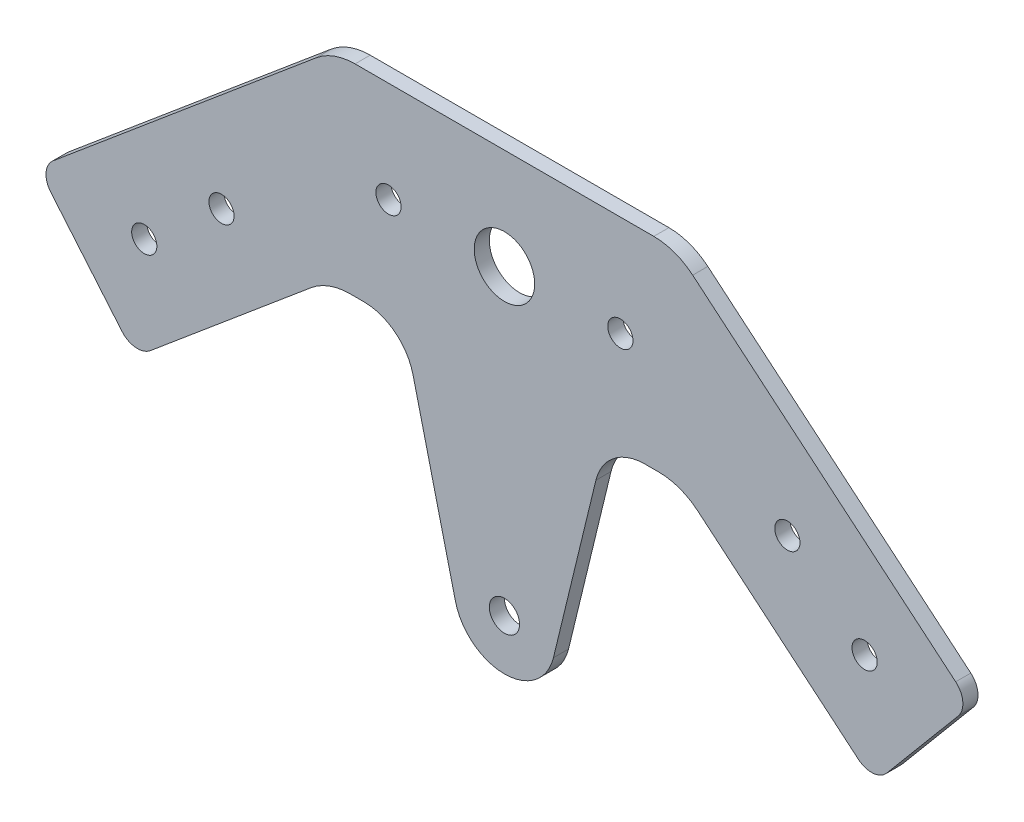
ISO-10303-21;
HEADER;
FILE_DESCRIPTION(('STEP AP214'),'2;1');
FILE_NAME('part.step','',(''),(''),'','','');
FILE_SCHEMA(('AUTOMOTIVE_DESIGN { 1 0 10303 214 1 1 1 1 }'));
ENDSEC;
DATA;
#1=APPLICATION_CONTEXT('core data for automotive mechanical design processes');
#2=APPLICATION_PROTOCOL_DEFINITION('international standard','automotive_design',2000,#1);
#3=PRODUCT_CONTEXT('',#1,'mechanical');
#4=PRODUCT('Part','Part','',(#3));
#5=PRODUCT_RELATED_PRODUCT_CATEGORY('part','',(#4));
#6=PRODUCT_DEFINITION_FORMATION('','',#4);
#7=PRODUCT_DEFINITION_CONTEXT('part definition',#1,'design');
#8=PRODUCT_DEFINITION('design','',#6,#7);
#9=PRODUCT_DEFINITION_SHAPE('','',#8);
#10=(LENGTH_UNIT() NAMED_UNIT(*) SI_UNIT(.MILLI.,.METRE.));
#11=(NAMED_UNIT(*) PLANE_ANGLE_UNIT() SI_UNIT($,.RADIAN.));
#12=(NAMED_UNIT(*) SI_UNIT($,.STERADIAN.) SOLID_ANGLE_UNIT());
#13=UNCERTAINTY_MEASURE_WITH_UNIT(LENGTH_MEASURE(1.E-05),#10,'distance_accuracy_value','');
#14=(GEOMETRIC_REPRESENTATION_CONTEXT(3) GLOBAL_UNCERTAINTY_ASSIGNED_CONTEXT((#13)) GLOBAL_UNIT_ASSIGNED_CONTEXT((#10,
#11,#12)) REPRESENTATION_CONTEXT('',''));
#15=CARTESIAN_POINT('',(0.,0.,0.));
#16=DIRECTION('',(0.,0.,1.));
#17=DIRECTION('',(1.,0.,0.));
#18=AXIS2_PLACEMENT_3D('',#15,#16,#17);
#19=CARTESIAN_POINT('',(32.3869359287038,-16.5346404567772,-3.));
#20=DIRECTION('',(0.,0.,1.));
#21=DIRECTION('',(1.,0.,0.));
#22=AXIS2_PLACEMENT_3D('',#19,#20,#21);
#23=CYLINDRICAL_SURFACE('',#22,10.);
#24=CARTESIAN_POINT('',(32.3869359287038,-16.5346404567772,0.));
#25=DIRECTION('',(0.,0.,-1.));
#26=DIRECTION('',(1.,0.,0.));
#27=AXIS2_PLACEMENT_3D('',#24,#25,#26);
#28=CIRCLE('',#27,10.);
#29=CARTESIAN_POINT('',(22.6691380416225,-14.1757415132365,0.));
#30=VERTEX_POINT('',#29);
#31=CARTESIAN_POINT('',(32.3869359287038,-6.53464045677716,0.));
#32=VERTEX_POINT('',#31);
#33=EDGE_CURVE('E216',#30,#32,#28,.T.);
#34=ORIENTED_EDGE('',*,*,#33,.F.);
#35=DIRECTION('',(0.,0.,1.));
#36=VECTOR('',#35,1.);
#37=CARTESIAN_POINT('',(22.6691380416225,-14.1757415132365,-3.));
#38=LINE('',#37,#36);
#39=CARTESIAN_POINT('',(22.6691380416225,-14.1757415132365,-3.));
#40=VERTEX_POINT('',#39);
#41=EDGE_CURVE('E11',#40,#30,#38,.T.);
#42=ORIENTED_EDGE('',*,*,#41,.F.);
#43=CARTESIAN_POINT('',(32.3869359287038,-16.5346404567772,-3.));
#44=DIRECTION('',(0.,0.,-1.));
#45=DIRECTION('',(1.,0.,0.));
#46=AXIS2_PLACEMENT_3D('',#43,#44,#45);
#47=CIRCLE('',#46,10.);
#48=CARTESIAN_POINT('',(32.3869359287038,-6.53464045677716,-3.));
#49=VERTEX_POINT('',#48);
#50=EDGE_CURVE('E279',#40,#49,#47,.T.);
#51=ORIENTED_EDGE('',*,*,#50,.T.);
#52=DIRECTION('',(0.,0.,1.));
#53=VECTOR('',#52,1.);
#54=CARTESIAN_POINT('',(32.3869359287038,-6.53464045677716,-3.));
#55=LINE('',#54,#53);
#56=EDGE_CURVE('E38',#49,#32,#55,.T.);
#57=ORIENTED_EDGE('',*,*,#56,.T.);
#58=EDGE_LOOP('',(#34,#42,#51,#57));
#59=FACE_BOUND('',#58,.T.);
#60=ADVANCED_FACE('F35',(#59),#23,.F.);
#61=CARTESIAN_POINT('',(22.6691380416225,-14.1757415132365,-3.));
#62=DIRECTION('',(0.971779788708134,-0.235889894354069,0.));
#63=DIRECTION('',(0.235889894354069,0.971779788708135,0.));
#64=AXIS2_PLACEMENT_3D('',#61,#62,#63);
#65=PLANE('',#64);
#66=DIRECTION('',(0.235889894354069,0.971779788708135,0.));
#67=VECTOR('',#66,1.);
#68=CARTESIAN_POINT('',(22.6691380416225,-14.1757415132365,0.));
#69=LINE('',#68,#67);
#70=CARTESIAN_POINT('',(14.2417373373162,-48.8935394003178,0.));
#71=VERTEX_POINT('',#70);
#72=EDGE_CURVE('E277',#71,#30,#69,.T.);
#73=ORIENTED_EDGE('',*,*,#72,.F.);
#74=DIRECTION('',(0.,0.,1.));
#75=VECTOR('',#74,1.);
#76=CARTESIAN_POINT('',(14.2417373373162,-48.8935394003178,-3.));
#77=LINE('',#76,#75);
#78=CARTESIAN_POINT('',(14.2417373373162,-48.8935394003178,-3.));
#79=VERTEX_POINT('',#78);
#80=EDGE_CURVE('E44',#79,#71,#77,.T.);
#81=ORIENTED_EDGE('',*,*,#80,.F.);
#82=DIRECTION('',(0.235889894354069,0.971779788708135,0.));
#83=VECTOR('',#82,1.);
#84=CARTESIAN_POINT('',(22.6691380416225,-14.1757415132365,-3.));
#85=LINE('',#84,#83);
#86=EDGE_CURVE('E206',#79,#40,#85,.T.);
#87=ORIENTED_EDGE('',*,*,#86,.T.);
#88=ORIENTED_EDGE('',*,*,#41,.T.);
#89=EDGE_LOOP('',(#73,#81,#87,#88));
#90=FACE_BOUND('',#89,.T.);
#91=ADVANCED_FACE('F320',(#90),#65,.T.);
#92=CARTESIAN_POINT('',(4.52393945023484,-46.5346404567771,-3.));
#93=DIRECTION('',(0.,0.,1.));
#94=DIRECTION('',(1.,0.,0.));
#95=AXIS2_PLACEMENT_3D('',#92,#93,#94);
#96=CYLINDRICAL_SURFACE('',#95,10.);
#97=CARTESIAN_POINT('',(4.52393945023484,-46.5346404567771,0.));
#98=DIRECTION('',(0.,0.,1.));
#99=DIRECTION('',(1.,0.,0.));
#100=AXIS2_PLACEMENT_3D('',#97,#98,#99);
#101=CIRCLE('',#100,10.);
#102=CARTESIAN_POINT('',(-5.19385843684652,-48.8935394003178,0.));
#103=VERTEX_POINT('',#102);
#104=EDGE_CURVE('E193',#103,#71,#101,.T.);
#105=ORIENTED_EDGE('',*,*,#104,.F.);
#106=DIRECTION('',(0.,0.,1.));
#107=VECTOR('',#106,1.);
#108=CARTESIAN_POINT('',(-5.19385843684652,-48.8935394003178,-3.));
#109=LINE('',#108,#107);
#110=CARTESIAN_POINT('',(-5.19385843684652,-48.8935394003178,-3.));
#111=VERTEX_POINT('',#110);
#112=EDGE_CURVE('E188',#111,#103,#109,.T.);
#113=ORIENTED_EDGE('',*,*,#112,.F.);
#114=CARTESIAN_POINT('',(4.52393945023484,-46.5346404567771,-3.));
#115=DIRECTION('',(0.,0.,1.));
#116=DIRECTION('',(1.,0.,0.));
#117=AXIS2_PLACEMENT_3D('',#114,#115,#116);
#118=CIRCLE('',#117,10.);
#119=EDGE_CURVE('E191',#111,#79,#118,.T.);
#120=ORIENTED_EDGE('',*,*,#119,.T.);
#121=ORIENTED_EDGE('',*,*,#80,.T.);
#122=EDGE_LOOP('',(#105,#113,#120,#121));
#123=FACE_BOUND('',#122,.T.);
#124=ADVANCED_FACE('F190',(#123),#96,.T.);
#125=CARTESIAN_POINT('',(-13.6212591411528,-14.1757415132365,-3.));
#126=DIRECTION('',(-0.971779788708135,-0.235889894354068,0.));
#127=DIRECTION('',(0.235889894354068,-0.971779788708135,0.));
#128=AXIS2_PLACEMENT_3D('',#125,#126,#127);
#129=PLANE('',#128);
#130=DIRECTION('',(0.235889894354068,-0.971779788708135,0.));
#131=VECTOR('',#130,1.);
#132=CARTESIAN_POINT('',(-13.6212591411528,-14.1757415132365,0.));
#133=LINE('',#132,#131);
#134=CARTESIAN_POINT('',(-13.6212591411528,-14.1757415132365,0.));
#135=VERTEX_POINT('',#134);
#136=EDGE_CURVE('E274',#135,#103,#133,.T.);
#137=ORIENTED_EDGE('',*,*,#136,.F.);
#138=DIRECTION('',(0.,0.,1.));
#139=VECTOR('',#138,1.);
#140=CARTESIAN_POINT('',(-13.6212591411528,-14.1757415132365,-3.));
#141=LINE('',#140,#139);
#142=CARTESIAN_POINT('',(-13.6212591411528,-14.1757415132365,-3.));
#143=VERTEX_POINT('',#142);
#144=EDGE_CURVE('E198',#143,#135,#141,.T.);
#145=ORIENTED_EDGE('',*,*,#144,.F.);
#146=DIRECTION('',(0.235889894354068,-0.971779788708135,0.));
#147=VECTOR('',#146,1.);
#148=CARTESIAN_POINT('',(-13.6212591411528,-14.1757415132365,-3.));
#149=LINE('',#148,#147);
#150=EDGE_CURVE('E204',#143,#111,#149,.T.);
#151=ORIENTED_EDGE('',*,*,#150,.T.);
#152=ORIENTED_EDGE('',*,*,#112,.T.);
#153=EDGE_LOOP('',(#137,#145,#151,#152));
#154=FACE_BOUND('',#153,.T.);
#155=ADVANCED_FACE('F208',(#154),#129,.T.);
#156=CARTESIAN_POINT('',(-23.3390570282341,-16.5346404567772,-3.));
#157=DIRECTION('',(0.,0.,1.));
#158=DIRECTION('',(1.,0.,0.));
#159=AXIS2_PLACEMENT_3D('',#156,#157,#158);
#160=CYLINDRICAL_SURFACE('',#159,10.);
#161=CARTESIAN_POINT('',(-23.3390570282341,-16.5346404567772,0.));
#162=DIRECTION('',(0.,0.,-1.));
#163=DIRECTION('',(1.,0.,0.));
#164=AXIS2_PLACEMENT_3D('',#161,#162,#163);
#165=CIRCLE('',#164,10.);
#166=CARTESIAN_POINT('',(-23.3390570282341,-6.53464045677716,0.));
#167=VERTEX_POINT('',#166);
#168=EDGE_CURVE('E271',#167,#135,#165,.T.);
#169=ORIENTED_EDGE('',*,*,#168,.F.);
#170=DIRECTION('',(0.,0.,1.));
#171=VECTOR('',#170,1.);
#172=CARTESIAN_POINT('',(-23.3390570282341,-6.53464045677716,-3.));
#173=LINE('',#172,#171);
#174=CARTESIAN_POINT('',(-23.3390570282341,-6.53464045677716,-3.));
#175=VERTEX_POINT('',#174);
#176=EDGE_CURVE('E283',#175,#167,#173,.T.);
#177=ORIENTED_EDGE('',*,*,#176,.F.);
#178=CARTESIAN_POINT('',(-23.3390570282341,-16.5346404567772,-3.));
#179=DIRECTION('',(0.,0.,-1.));
#180=DIRECTION('',(1.,0.,0.));
#181=AXIS2_PLACEMENT_3D('',#178,#179,#180);
#182=CIRCLE('',#181,10.);
#183=EDGE_CURVE('E209',#175,#143,#182,.T.);
#184=ORIENTED_EDGE('',*,*,#183,.T.);
#185=ORIENTED_EDGE('',*,*,#144,.T.);
#186=EDGE_LOOP('',(#169,#177,#184,#185));
#187=FACE_BOUND('',#186,.T.);
#188=ADVANCED_FACE('F333',(#187),#160,.F.);
#189=CARTESIAN_POINT('',(-26.1084177385707,-6.53464045677716,-3.));
#190=DIRECTION('',(0.,-1.,0.));
#191=DIRECTION('',(1.,0.,0.));
#192=AXIS2_PLACEMENT_3D('',#189,#190,#191);
#193=PLANE('',#192);
#194=DIRECTION('',(1.,0.,0.));
#195=VECTOR('',#194,1.);
#196=CARTESIAN_POINT('',(-26.1084177385707,-6.53464045677716,0.));
#197=LINE('',#196,#195);
#198=CARTESIAN_POINT('',(-26.1084177385707,-6.53464045677716,0.));
#199=VERTEX_POINT('',#198);
#200=EDGE_CURVE('E268',#199,#167,#197,.T.);
#201=ORIENTED_EDGE('',*,*,#200,.F.);
#202=DIRECTION('',(0.,0.,1.));
#203=VECTOR('',#202,1.);
#204=CARTESIAN_POINT('',(-26.1084177385707,-6.53464045677716,-3.));
#205=LINE('',#204,#203);
#206=CARTESIAN_POINT('',(-26.1084177385707,-6.53464045677716,-3.));
#207=VERTEX_POINT('',#206);
#208=EDGE_CURVE('E285',#207,#199,#205,.T.);
#209=ORIENTED_EDGE('',*,*,#208,.F.);
#210=DIRECTION('',(1.,0.,0.));
#211=VECTOR('',#210,1.);
#212=CARTESIAN_POINT('',(-26.1084177385707,-6.53464045677716,-3.));
#213=LINE('',#212,#211);
#214=EDGE_CURVE('E211',#207,#175,#213,.T.);
#215=ORIENTED_EDGE('',*,*,#214,.T.);
#216=ORIENTED_EDGE('',*,*,#176,.T.);
#217=EDGE_LOOP('',(#201,#209,#215,#216));
#218=FACE_BOUND('',#217,.T.);
#219=ADVANCED_FACE('F336',(#218),#193,.T.);
#220=CARTESIAN_POINT('',(-26.1084177385707,-18.5346404567772,-3.));
#221=DIRECTION('',(0.,0.,1.));
#222=DIRECTION('',(1.,0.,0.));
#223=AXIS2_PLACEMENT_3D('',#220,#221,#222);
#224=CYLINDRICAL_SURFACE('',#223,12.);
#225=CARTESIAN_POINT('',(-26.1084177385707,-18.5346404567772,0.));
#226=DIRECTION('',(0.,0.,-1.));
#227=DIRECTION('',(1.,0.,0.));
#228=AXIS2_PLACEMENT_3D('',#225,#226,#227);
#229=CIRCLE('',#228,12.);
#230=CARTESIAN_POINT('',(-33.8218690548092,-9.34210713934941,0.));
#231=VERTEX_POINT('',#230);
#232=EDGE_CURVE('E265',#231,#199,#229,.T.);
#233=ORIENTED_EDGE('',*,*,#232,.F.);
#234=DIRECTION('',(0.,0.,1.));
#235=VECTOR('',#234,1.);
#236=CARTESIAN_POINT('',(-33.8218690548092,-9.34210713934941,-3.));
#237=LINE('',#236,#235);
#238=CARTESIAN_POINT('',(-33.8218690548092,-9.34210713934941,-3.));
#239=VERTEX_POINT('',#238);
#240=EDGE_CURVE('E287',#239,#231,#237,.T.);
#241=ORIENTED_EDGE('',*,*,#240,.F.);
#242=CARTESIAN_POINT('',(-26.1084177385707,-18.5346404567772,-3.));
#243=DIRECTION('',(0.,0.,-1.));
#244=DIRECTION('',(1.,0.,0.));
#245=AXIS2_PLACEMENT_3D('',#242,#243,#244);
#246=CIRCLE('',#245,12.);
#247=EDGE_CURVE('E539',#239,#207,#246,.T.);
#248=ORIENTED_EDGE('',*,*,#247,.T.);
#249=ORIENTED_EDGE('',*,*,#208,.T.);
#250=EDGE_LOOP('',(#233,#241,#248,#249));
#251=FACE_BOUND('',#250,.T.);
#252=ADVANCED_FACE('F340',(#251),#224,.F.);
#253=CARTESIAN_POINT('',(-33.8218690548092,-9.34210713934941,-3.));
#254=DIRECTION('',(0.642787609686539,-0.766044443118979,0.));
#255=DIRECTION('',(0.766044443118979,0.642787609686539,0.));
#256=AXIS2_PLACEMENT_3D('',#253,#254,#255);
#257=PLANE('',#256);
#258=DIRECTION('',(0.766044443118979,0.642787609686539,0.));
#259=VECTOR('',#258,1.);
#260=CARTESIAN_POINT('',(-33.8218690548092,-9.34210713934941,0.));
#261=LINE('',#260,#259);
#262=CARTESIAN_POINT('',(-65.7141049332381,-36.1028705023579,0.));
#263=VERTEX_POINT('',#262);
#264=EDGE_CURVE('E262',#263,#231,#261,.T.);
#265=ORIENTED_EDGE('',*,*,#264,.F.);
#266=DIRECTION('',(0.,0.,1.));
#267=VECTOR('',#266,1.);
#268=CARTESIAN_POINT('',(-65.7141049332381,-36.1028705023579,-3.));
#269=LINE('',#268,#267);
#270=CARTESIAN_POINT('',(-65.7141049332381,-36.1028705023579,-3.));
#271=VERTEX_POINT('',#270);
#272=EDGE_CURVE('E289',#271,#263,#269,.T.);
#273=ORIENTED_EDGE('',*,*,#272,.F.);
#274=DIRECTION('',(0.766044443118979,0.642787609686539,0.));
#275=VECTOR('',#274,1.);
#276=CARTESIAN_POINT('',(-33.8218690548092,-9.34210713934941,-3.));
#277=LINE('',#276,#275);
#278=EDGE_CURVE('E536',#271,#239,#277,.T.);
#279=ORIENTED_EDGE('',*,*,#278,.T.);
#280=ORIENTED_EDGE('',*,*,#240,.T.);
#281=EDGE_LOOP('',(#265,#273,#279,#280));
#282=FACE_BOUND('',#281,.T.);
#283=ADVANCED_FACE('F344',(#282),#257,.T.);
#284=CARTESIAN_POINT('',(-68.2852553719843,-33.038692729882,-3.));
#285=DIRECTION('',(0.,0.,1.));
#286=DIRECTION('',(1.,0.,0.));
#287=AXIS2_PLACEMENT_3D('',#284,#285,#286);
#288=CYLINDRICAL_SURFACE('',#287,4.00000000000001);
#289=CARTESIAN_POINT('',(-68.2852553719843,-33.038692729882,0.));
#290=DIRECTION('',(0.,0.,1.));
#291=DIRECTION('',(-1.,0.,0.));
#292=AXIS2_PLACEMENT_3D('',#289,#290,#291);
#293=CIRCLE('',#292,4.00000000000001);
#294=CARTESIAN_POINT('',(-71.3494331444602,-35.6098431686282,0.));
#295=VERTEX_POINT('',#294);
#296=EDGE_CURVE('E259',#295,#263,#293,.T.);
#297=ORIENTED_EDGE('',*,*,#296,.F.);
#298=DIRECTION('',(0.,0.,1.));
#299=VECTOR('',#298,1.);
#300=CARTESIAN_POINT('',(-71.3494331444602,-35.6098431686282,-3.));
#301=LINE('',#300,#299);
#302=CARTESIAN_POINT('',(-71.3494331444602,-35.6098431686282,-3.));
#303=VERTEX_POINT('',#302);
#304=EDGE_CURVE('E291',#303,#295,#301,.T.);
#305=ORIENTED_EDGE('',*,*,#304,.F.);
#306=CARTESIAN_POINT('',(-68.2852553719843,-33.038692729882,-3.));
#307=DIRECTION('',(0.,0.,1.));
#308=DIRECTION('',(-1.,0.,0.));
#309=AXIS2_PLACEMENT_3D('',#306,#307,#308);
#310=CIRCLE('',#309,4.00000000000001);
#311=EDGE_CURVE('E533',#303,#271,#310,.T.);
#312=ORIENTED_EDGE('',*,*,#311,.T.);
#313=ORIENTED_EDGE('',*,*,#272,.T.);
#314=EDGE_LOOP('',(#297,#305,#312,#313));
#315=FACE_BOUND('',#314,.T.);
#316=ADVANCED_FACE('F348',(#315),#288,.T.);
#317=CARTESIAN_POINT('',(-71.3494331444602,-35.6098431686282,-3.));
#318=DIRECTION('',(-0.766044443118979,-0.642787609686538,0.));
#319=DIRECTION('',(0.642787609686539,-0.766044443118979,0.));
#320=AXIS2_PLACEMENT_3D('',#317,#318,#319);
#321=PLANE('',#320);
#322=DIRECTION('',(0.642787609686538,-0.766044443118979,0.));
#323=VECTOR('',#322,1.);
#324=CARTESIAN_POINT('',(-71.3494331444602,-35.6098431686282,0.));
#325=LINE('',#324,#323);
#326=CARTESIAN_POINT('',(-85.4907605575641,-18.7568654200106,0.));
#327=VERTEX_POINT('',#326);
#328=EDGE_CURVE('E256',#327,#295,#325,.T.);
#329=ORIENTED_EDGE('',*,*,#328,.F.);
#330=DIRECTION('',(0.,0.,1.));
#331=VECTOR('',#330,1.);
#332=CARTESIAN_POINT('',(-85.4907605575641,-18.7568654200106,-3.));
#333=LINE('',#332,#331);
#334=CARTESIAN_POINT('',(-85.4907605575641,-18.7568654200106,-3.));
#335=VERTEX_POINT('',#334);
#336=EDGE_CURVE('E293',#335,#327,#333,.T.);
#337=ORIENTED_EDGE('',*,*,#336,.F.);
#338=DIRECTION('',(0.642787609686538,-0.766044443118979,0.));
#339=VECTOR('',#338,1.);
#340=CARTESIAN_POINT('',(-71.3494331444602,-35.6098431686282,-3.));
#341=LINE('',#340,#339);
#342=EDGE_CURVE('E530',#335,#303,#341,.T.);
#343=ORIENTED_EDGE('',*,*,#342,.T.);
#344=ORIENTED_EDGE('',*,*,#304,.T.);
#345=EDGE_LOOP('',(#329,#337,#343,#344));
#346=FACE_BOUND('',#345,.T.);
#347=ADVANCED_FACE('F352',(#346),#321,.T.);
#348=CARTESIAN_POINT('',(-82.4265827850881,-16.1857149812645,-3.));
#349=DIRECTION('',(0.,0.,1.));
#350=DIRECTION('',(1.,0.,0.));
#351=AXIS2_PLACEMENT_3D('',#348,#349,#350);
#352=CYLINDRICAL_SURFACE('',#351,4.00000000000001);
#353=CARTESIAN_POINT('',(-82.4265827850881,-16.1857149812645,0.));
#354=DIRECTION('',(0.,0.,1.));
#355=DIRECTION('',(1.,0.,0.));
#356=AXIS2_PLACEMENT_3D('',#353,#354,#355);
#357=CIRCLE('',#356,4.00000000000001);
#358=CARTESIAN_POINT('',(-84.9977332238343,-13.1215372087886,0.));
#359=VERTEX_POINT('',#358);
#360=EDGE_CURVE('E253',#359,#327,#357,.T.);
#361=ORIENTED_EDGE('',*,*,#360,.F.);
#362=DIRECTION('',(0.,0.,1.));
#363=VECTOR('',#362,1.);
#364=CARTESIAN_POINT('',(-84.9977332238343,-13.1215372087886,-3.));
#365=LINE('',#364,#363);
#366=CARTESIAN_POINT('',(-84.9977332238343,-13.1215372087886,-3.));
#367=VERTEX_POINT('',#366);
#368=EDGE_CURVE('E295',#367,#359,#365,.T.);
#369=ORIENTED_EDGE('',*,*,#368,.F.);
#370=CARTESIAN_POINT('',(-82.4265827850881,-16.1857149812645,-3.));
#371=DIRECTION('',(0.,0.,1.));
#372=DIRECTION('',(1.,0.,0.));
#373=AXIS2_PLACEMENT_3D('',#370,#371,#372);
#374=CIRCLE('',#373,4.00000000000001);
#375=EDGE_CURVE('E527',#367,#335,#374,.T.);
#376=ORIENTED_EDGE('',*,*,#375,.T.);
#377=ORIENTED_EDGE('',*,*,#336,.T.);
#378=EDGE_LOOP('',(#361,#369,#376,#377));
#379=FACE_BOUND('',#378,.T.);
#380=ADVANCED_FACE('F356',(#379),#352,.T.);
#381=CARTESIAN_POINT('',(-84.9977332238343,-13.1215372087886,-3.));
#382=DIRECTION('',(-0.642787609686538,0.766044443118979,0.));
#383=DIRECTION('',(-0.766044443118979,-0.642787609686538,0.));
#384=AXIS2_PLACEMENT_3D('',#381,#382,#383);
#385=PLANE('',#384);
#386=DIRECTION('',(-0.766044443118979,-0.642787609686538,0.));
#387=VECTOR('',#386,1.);
#388=CARTESIAN_POINT('',(-84.9977332238343,-13.1215372087886,0.));
#389=LINE('',#388,#387);
#390=CARTESIAN_POINT('',(-32.8234401568532,30.6578928606505,0.));
#391=VERTEX_POINT('',#390);
#392=EDGE_CURVE('E250',#391,#359,#389,.T.);
#393=ORIENTED_EDGE('',*,*,#392,.F.);
#394=DIRECTION('',(0.,0.,1.));
#395=VECTOR('',#394,1.);
#396=CARTESIAN_POINT('',(-32.8234401568532,30.6578928606505,-3.));
#397=LINE('',#396,#395);
#398=CARTESIAN_POINT('',(-32.8234401568532,30.6578928606505,-3.));
#399=VERTEX_POINT('',#398);
#400=EDGE_CURVE('E297',#399,#391,#397,.T.);
#401=ORIENTED_EDGE('',*,*,#400,.F.);
#402=DIRECTION('',(-0.766044443118979,-0.642787609686538,0.));
#403=VECTOR('',#402,1.);
#404=CARTESIAN_POINT('',(-84.9977332238343,-13.1215372087886,-3.));
#405=LINE('',#404,#403);
#406=EDGE_CURVE('E524',#399,#367,#405,.T.);
#407=ORIENTED_EDGE('',*,*,#406,.T.);
#408=ORIENTED_EDGE('',*,*,#368,.T.);
#409=EDGE_LOOP('',(#393,#401,#407,#408));
#410=FACE_BOUND('',#409,.T.);
#411=ADVANCED_FACE('F360',(#410),#385,.T.);
#412=CARTESIAN_POINT('',(-25.1099888406147,21.4653595432228,-3.));
#413=DIRECTION('',(0.,0.,1.));
#414=DIRECTION('',(1.,0.,0.));
#415=AXIS2_PLACEMENT_3D('',#412,#413,#414);
#416=CYLINDRICAL_SURFACE('',#415,12.);
#417=CARTESIAN_POINT('',(-25.1099888406147,21.4653595432228,0.));
#418=DIRECTION('',(0.,0.,1.));
#419=DIRECTION('',(-1.,0.,0.));
#420=AXIS2_PLACEMENT_3D('',#417,#418,#419);
#421=CIRCLE('',#420,12.);
#422=CARTESIAN_POINT('',(-25.1099888406147,33.4653595432228,0.));
#423=VERTEX_POINT('',#422);
#424=EDGE_CURVE('E247',#423,#391,#421,.T.);
#425=ORIENTED_EDGE('',*,*,#424,.F.);
#426=DIRECTION('',(0.,0.,1.));
#427=VECTOR('',#426,1.);
#428=CARTESIAN_POINT('',(-25.1099888406147,33.4653595432228,-3.));
#429=LINE('',#428,#427);
#430=CARTESIAN_POINT('',(-25.1099888406147,33.4653595432228,-3.));
#431=VERTEX_POINT('',#430);
#432=EDGE_CURVE('E299',#431,#423,#429,.T.);
#433=ORIENTED_EDGE('',*,*,#432,.F.);
#434=CARTESIAN_POINT('',(-25.1099888406147,21.4653595432228,-3.));
#435=DIRECTION('',(0.,0.,1.));
#436=DIRECTION('',(-1.,0.,0.));
#437=AXIS2_PLACEMENT_3D('',#434,#435,#436);
#438=CIRCLE('',#437,12.);
#439=EDGE_CURVE('E521',#431,#399,#438,.T.);
#440=ORIENTED_EDGE('',*,*,#439,.T.);
#441=ORIENTED_EDGE('',*,*,#400,.T.);
#442=EDGE_LOOP('',(#425,#433,#440,#441));
#443=FACE_BOUND('',#442,.T.);
#444=ADVANCED_FACE('F364',(#443),#416,.T.);
#445=CARTESIAN_POINT('',(-25.1099888406147,33.4653595432228,-3.));
#446=DIRECTION('',(0.,1.,0.));
#447=DIRECTION('',(0.,0.,1.));
#448=AXIS2_PLACEMENT_3D('',#445,#446,#447);
#449=PLANE('',#448);
#450=DIRECTION('',(-1.,0.,0.));
#451=VECTOR('',#450,1.);
#452=CARTESIAN_POINT('',(-25.1099888406147,33.4653595432228,0.));
#453=LINE('',#452,#451);
#454=CARTESIAN_POINT('',(34.1578677410844,33.4653595432228,0.));
#455=VERTEX_POINT('',#454);
#456=EDGE_CURVE('E244',#455,#423,#453,.T.);
#457=ORIENTED_EDGE('',*,*,#456,.F.);
#458=DIRECTION('',(0.,0.,1.));
#459=VECTOR('',#458,1.);
#460=CARTESIAN_POINT('',(34.1578677410844,33.4653595432228,-3.));
#461=LINE('',#460,#459);
#462=CARTESIAN_POINT('',(34.1578677410844,33.4653595432228,-3.));
#463=VERTEX_POINT('',#462);
#464=EDGE_CURVE('E301',#463,#455,#461,.T.);
#465=ORIENTED_EDGE('',*,*,#464,.F.);
#466=DIRECTION('',(-1.,0.,0.));
#467=VECTOR('',#466,1.);
#468=CARTESIAN_POINT('',(34.1578677410844,33.4653595432228,-3.));
#469=LINE('',#468,#467);
#470=EDGE_CURVE('E519',#463,#431,#469,.T.);
#471=ORIENTED_EDGE('',*,*,#470,.T.);
#472=ORIENTED_EDGE('',*,*,#432,.T.);
#473=EDGE_LOOP('',(#457,#465,#471,#472));
#474=FACE_BOUND('',#473,.T.);
#475=ADVANCED_FACE('F368',(#474),#449,.T.);
#476=CARTESIAN_POINT('',(34.1578677410844,21.4653595432228,-3.));
#477=DIRECTION('',(0.,0.,1.));
#478=DIRECTION('',(1.,0.,0.));
#479=AXIS2_PLACEMENT_3D('',#476,#477,#478);
#480=CYLINDRICAL_SURFACE('',#479,12.);
#481=CARTESIAN_POINT('',(34.1578677410844,21.4653595432228,0.));
#482=DIRECTION('',(0.,0.,1.));
#483=DIRECTION('',(1.,0.,0.));
#484=AXIS2_PLACEMENT_3D('',#481,#482,#483);
#485=CIRCLE('',#484,12.);
#486=CARTESIAN_POINT('',(41.8713190573229,30.6578928606506,0.));
#487=VERTEX_POINT('',#486);
#488=EDGE_CURVE('E241',#487,#455,#485,.T.);
#489=ORIENTED_EDGE('',*,*,#488,.F.);
#490=DIRECTION('',(0.,0.,1.));
#491=VECTOR('',#490,1.);
#492=CARTESIAN_POINT('',(41.8713190573229,30.6578928606506,-3.));
#493=LINE('',#492,#491);
#494=CARTESIAN_POINT('',(41.8713190573229,30.6578928606506,-3.));
#495=VERTEX_POINT('',#494);
#496=EDGE_CURVE('E304',#495,#487,#493,.T.);
#497=ORIENTED_EDGE('',*,*,#496,.F.);
#498=CARTESIAN_POINT('',(34.1578677410844,21.4653595432228,-3.));
#499=DIRECTION('',(0.,0.,1.));
#500=DIRECTION('',(1.,0.,0.));
#501=AXIS2_PLACEMENT_3D('',#498,#499,#500);
#502=CIRCLE('',#501,12.);
#503=EDGE_CURVE('E516',#495,#463,#502,.T.);
#504=ORIENTED_EDGE('',*,*,#503,.T.);
#505=ORIENTED_EDGE('',*,*,#464,.T.);
#506=EDGE_LOOP('',(#489,#497,#504,#505));
#507=FACE_BOUND('',#506,.T.);
#508=ADVANCED_FACE('F372',(#507),#480,.T.);
#509=CARTESIAN_POINT('',(94.045612124304,-13.1215372087885,-3.));
#510=DIRECTION('',(0.642787609686538,0.766044443118979,0.));
#511=DIRECTION('',(-0.766044443118979,0.642787609686538,0.));
#512=AXIS2_PLACEMENT_3D('',#509,#510,#511);
#513=PLANE('',#512);
#514=DIRECTION('',(-0.766044443118979,0.642787609686538,0.));
#515=VECTOR('',#514,1.);
#516=CARTESIAN_POINT('',(94.045612124304,-13.1215372087885,0.));
#517=LINE('',#516,#515);
#518=CARTESIAN_POINT('',(94.045612124304,-13.1215372087886,0.));
#519=VERTEX_POINT('',#518);
#520=EDGE_CURVE('E238',#519,#487,#517,.T.);
#521=ORIENTED_EDGE('',*,*,#520,.F.);
#522=DIRECTION('',(0.,0.,1.));
#523=VECTOR('',#522,1.);
#524=CARTESIAN_POINT('',(94.045612124304,-13.1215372087886,-3.));
#525=LINE('',#524,#523);
#526=CARTESIAN_POINT('',(94.045612124304,-13.1215372087886,-3.));
#527=VERTEX_POINT('',#526);
#528=EDGE_CURVE('E306',#527,#519,#525,.T.);
#529=ORIENTED_EDGE('',*,*,#528,.F.);
#530=DIRECTION('',(-0.766044443118979,0.642787609686538,0.));
#531=VECTOR('',#530,1.);
#532=CARTESIAN_POINT('',(94.045612124304,-13.1215372087885,-3.));
#533=LINE('',#532,#531);
#534=EDGE_CURVE('E513',#527,#495,#533,.T.);
#535=ORIENTED_EDGE('',*,*,#534,.T.);
#536=ORIENTED_EDGE('',*,*,#496,.T.);
#537=EDGE_LOOP('',(#521,#529,#535,#536));
#538=FACE_BOUND('',#537,.T.);
#539=ADVANCED_FACE('F376',(#538),#513,.T.);
#540=CARTESIAN_POINT('',(91.4744616855579,-16.1857149812645,-3.));
#541=DIRECTION('',(0.,0.,1.));
#542=DIRECTION('',(1.,0.,0.));
#543=AXIS2_PLACEMENT_3D('',#540,#541,#542);
#544=CYLINDRICAL_SURFACE('',#543,4.);
#545=CARTESIAN_POINT('',(91.4744616855579,-16.1857149812645,0.));
#546=DIRECTION('',(0.,0.,1.));
#547=DIRECTION('',(-1.,0.,0.));
#548=AXIS2_PLACEMENT_3D('',#545,#546,#547);
#549=CIRCLE('',#548,4.);
#550=CARTESIAN_POINT('',(94.5386394580338,-18.7568654200106,0.));
#551=VERTEX_POINT('',#550);
#552=EDGE_CURVE('E235',#551,#519,#549,.T.);
#553=ORIENTED_EDGE('',*,*,#552,.F.);
#554=DIRECTION('',(0.,0.,1.));
#555=VECTOR('',#554,1.);
#556=CARTESIAN_POINT('',(94.5386394580338,-18.7568654200106,-3.));
#557=LINE('',#556,#555);
#558=CARTESIAN_POINT('',(94.5386394580338,-18.7568654200106,-3.));
#559=VERTEX_POINT('',#558);
#560=EDGE_CURVE('E308',#559,#551,#557,.T.);
#561=ORIENTED_EDGE('',*,*,#560,.F.);
#562=CARTESIAN_POINT('',(91.4744616855579,-16.1857149812645,-3.));
#563=DIRECTION('',(0.,0.,1.));
#564=DIRECTION('',(-1.,0.,0.));
#565=AXIS2_PLACEMENT_3D('',#562,#563,#564);
#566=CIRCLE('',#565,4.);
#567=EDGE_CURVE('E510',#559,#527,#566,.T.);
#568=ORIENTED_EDGE('',*,*,#567,.T.);
#569=ORIENTED_EDGE('',*,*,#528,.T.);
#570=EDGE_LOOP('',(#553,#561,#568,#569));
#571=FACE_BOUND('',#570,.T.);
#572=ADVANCED_FACE('F380',(#571),#544,.T.);
#573=CARTESIAN_POINT('',(94.5386394580338,-18.7568654200106,-3.));
#574=DIRECTION('',(0.766044443118979,-0.642787609686538,0.));
#575=DIRECTION('',(0.642787609686538,0.766044443118979,0.));
#576=AXIS2_PLACEMENT_3D('',#573,#574,#575);
#577=PLANE('',#576);
#578=DIRECTION('',(0.642787609686538,0.766044443118979,0.));
#579=VECTOR('',#578,1.);
#580=CARTESIAN_POINT('',(94.5386394580338,-18.7568654200106,0.));
#581=LINE('',#580,#579);
#582=CARTESIAN_POINT('',(80.39731204493,-35.6098431686281,0.));
#583=VERTEX_POINT('',#582);
#584=EDGE_CURVE('E232',#583,#551,#581,.T.);
#585=ORIENTED_EDGE('',*,*,#584,.F.);
#586=DIRECTION('',(0.,0.,1.));
#587=VECTOR('',#586,1.);
#588=CARTESIAN_POINT('',(80.39731204493,-35.6098431686281,-3.));
#589=LINE('',#588,#587);
#590=CARTESIAN_POINT('',(80.39731204493,-35.6098431686281,-3.));
#591=VERTEX_POINT('',#590);
#592=EDGE_CURVE('E310',#591,#583,#589,.T.);
#593=ORIENTED_EDGE('',*,*,#592,.F.);
#594=DIRECTION('',(0.642787609686538,0.766044443118979,0.));
#595=VECTOR('',#594,1.);
#596=CARTESIAN_POINT('',(94.5386394580338,-18.7568654200106,-3.));
#597=LINE('',#596,#595);
#598=EDGE_CURVE('E507',#591,#559,#597,.T.);
#599=ORIENTED_EDGE('',*,*,#598,.T.);
#600=ORIENTED_EDGE('',*,*,#560,.T.);
#601=EDGE_LOOP('',(#585,#593,#599,#600));
#602=FACE_BOUND('',#601,.T.);
#603=ADVANCED_FACE('F384',(#602),#577,.T.);
#604=CARTESIAN_POINT('',(77.3331342724541,-33.038692729882,-3.));
#605=DIRECTION('',(0.,0.,1.));
#606=DIRECTION('',(1.,0.,0.));
#607=AXIS2_PLACEMENT_3D('',#604,#605,#606);
#608=CYLINDRICAL_SURFACE('',#607,3.99999999999999);
#609=CARTESIAN_POINT('',(77.3331342724541,-33.038692729882,0.));
#610=DIRECTION('',(0.,0.,1.));
#611=DIRECTION('',(-1.,0.,0.));
#612=AXIS2_PLACEMENT_3D('',#609,#610,#611);
#613=CIRCLE('',#612,3.99999999999999);
#614=CARTESIAN_POINT('',(74.761983833708,-36.1028705023579,0.));
#615=VERTEX_POINT('',#614);
#616=EDGE_CURVE('E229',#615,#583,#613,.T.);
#617=ORIENTED_EDGE('',*,*,#616,.F.);
#618=DIRECTION('',(0.,0.,1.));
#619=VECTOR('',#618,1.);
#620=CARTESIAN_POINT('',(74.761983833708,-36.1028705023579,-3.));
#621=LINE('',#620,#619);
#622=CARTESIAN_POINT('',(74.761983833708,-36.1028705023579,-3.));
#623=VERTEX_POINT('',#622);
#624=EDGE_CURVE('E312',#623,#615,#621,.T.);
#625=ORIENTED_EDGE('',*,*,#624,.F.);
#626=CARTESIAN_POINT('',(77.3331342724541,-33.038692729882,-3.));
#627=DIRECTION('',(0.,0.,1.));
#628=DIRECTION('',(-1.,0.,0.));
#629=AXIS2_PLACEMENT_3D('',#626,#627,#628);
#630=CIRCLE('',#629,3.99999999999999);
#631=EDGE_CURVE('E504',#623,#591,#630,.T.);
#632=ORIENTED_EDGE('',*,*,#631,.T.);
#633=ORIENTED_EDGE('',*,*,#592,.T.);
#634=EDGE_LOOP('',(#617,#625,#632,#633));
#635=FACE_BOUND('',#634,.T.);
#636=ADVANCED_FACE('F388',(#635),#608,.T.);
#637=CARTESIAN_POINT('',(74.761983833708,-36.1028705023579,-3.));
#638=DIRECTION('',(-0.642787609686537,-0.76604444311898,0.));
#639=DIRECTION('',(0.76604444311898,-0.642787609686537,0.));
#640=AXIS2_PLACEMENT_3D('',#637,#638,#639);
#641=PLANE('',#640);
#642=DIRECTION('',(0.76604444311898,-0.642787609686537,0.));
#643=VECTOR('',#642,1.);
#644=CARTESIAN_POINT('',(74.761983833708,-36.1028705023579,0.));
#645=LINE('',#644,#643);
#646=CARTESIAN_POINT('',(42.8697479552789,-9.34210713934939,0.));
#647=VERTEX_POINT('',#646);
#648=EDGE_CURVE('E226',#647,#615,#645,.T.);
#649=ORIENTED_EDGE('',*,*,#648,.F.);
#650=DIRECTION('',(0.,0.,1.));
#651=VECTOR('',#650,1.);
#652=CARTESIAN_POINT('',(42.8697479552789,-9.34210713934939,-3.));
#653=LINE('',#652,#651);
#654=CARTESIAN_POINT('',(42.8697479552789,-9.34210713934939,-3.));
#655=VERTEX_POINT('',#654);
#656=EDGE_CURVE('E314',#655,#647,#653,.T.);
#657=ORIENTED_EDGE('',*,*,#656,.F.);
#658=DIRECTION('',(0.76604444311898,-0.642787609686537,0.));
#659=VECTOR('',#658,1.);
#660=CARTESIAN_POINT('',(74.761983833708,-36.1028705023579,-3.));
#661=LINE('',#660,#659);
#662=EDGE_CURVE('E501',#655,#623,#661,.T.);
#663=ORIENTED_EDGE('',*,*,#662,.T.);
#664=ORIENTED_EDGE('',*,*,#624,.T.);
#665=EDGE_LOOP('',(#649,#657,#663,#664));
#666=FACE_BOUND('',#665,.T.);
#667=ADVANCED_FACE('F392',(#666),#641,.T.);
#668=CARTESIAN_POINT('',(35.1562966390405,-18.5346404567772,-3.));
#669=DIRECTION('',(0.,0.,1.));
#670=DIRECTION('',(1.,0.,0.));
#671=AXIS2_PLACEMENT_3D('',#668,#669,#670);
#672=CYLINDRICAL_SURFACE('',#671,12.);
#673=CARTESIAN_POINT('',(35.1562966390405,-18.5346404567772,0.));
#674=DIRECTION('',(0.,0.,-1.));
#675=DIRECTION('',(1.,0.,0.));
#676=AXIS2_PLACEMENT_3D('',#673,#674,#675);
#677=CIRCLE('',#676,12.);
#678=CARTESIAN_POINT('',(35.1562966390405,-6.53464045677716,0.));
#679=VERTEX_POINT('',#678);
#680=EDGE_CURVE('E223',#679,#647,#677,.T.);
#681=ORIENTED_EDGE('',*,*,#680,.F.);
#682=DIRECTION('',(0.,0.,1.));
#683=VECTOR('',#682,1.);
#684=CARTESIAN_POINT('',(35.1562966390405,-6.53464045677716,-3.));
#685=LINE('',#684,#683);
#686=CARTESIAN_POINT('',(35.1562966390405,-6.53464045677716,-3.));
#687=VERTEX_POINT('',#686);
#688=EDGE_CURVE('E315',#687,#679,#685,.T.);
#689=ORIENTED_EDGE('',*,*,#688,.F.);
#690=CARTESIAN_POINT('',(35.1562966390405,-18.5346404567772,-3.));
#691=DIRECTION('',(0.,0.,-1.));
#692=DIRECTION('',(1.,0.,0.));
#693=AXIS2_PLACEMENT_3D('',#690,#691,#692);
#694=CIRCLE('',#693,12.);
#695=EDGE_CURVE('E498',#687,#655,#694,.T.);
#696=ORIENTED_EDGE('',*,*,#695,.T.);
#697=ORIENTED_EDGE('',*,*,#656,.T.);
#698=EDGE_LOOP('',(#681,#689,#696,#697));
#699=FACE_BOUND('',#698,.T.);
#700=ADVANCED_FACE('F396',(#699),#672,.F.);
#701=CARTESIAN_POINT('',(35.1562966390405,-6.53464045677716,-3.));
#702=DIRECTION('',(0.,-1.,0.));
#703=DIRECTION('',(1.,0.,0.));
#704=AXIS2_PLACEMENT_3D('',#701,#702,#703);
#705=PLANE('',#704);
#706=DIRECTION('',(1.,0.,0.));
#707=VECTOR('',#706,1.);
#708=CARTESIAN_POINT('',(35.1562966390405,-6.53464045677716,0.));
#709=LINE('',#708,#707);
#710=EDGE_CURVE('E219',#32,#679,#709,.T.);
#711=ORIENTED_EDGE('',*,*,#710,.F.);
#712=ORIENTED_EDGE('',*,*,#56,.F.);
#713=DIRECTION('',(1.,0.,0.));
#714=VECTOR('',#713,1.);
#715=CARTESIAN_POINT('',(35.1562966390405,-6.53464045677716,-3.));
#716=LINE('',#715,#714);
#717=EDGE_CURVE('E496',#49,#687,#716,.T.);
#718=ORIENTED_EDGE('',*,*,#717,.T.);
#719=ORIENTED_EDGE('',*,*,#688,.T.);
#720=EDGE_LOOP('',(#711,#712,#718,#719));
#721=FACE_BOUND('',#720,.T.);
#722=ADVANCED_FACE('F317',(#721),#705,.T.);
#723=CARTESIAN_POINT('',(32.3869359287038,-16.5346404567772,-3.));
#724=DIRECTION('',(0.,0.,1.));
#725=DIRECTION('',(1.,0.,0.));
#726=AXIS2_PLACEMENT_3D('',#723,#724,#725);
#727=PLANE('',#726);
#728=CARTESIAN_POINT('',(27.5239394502349,13.4653595432228,-3.));
#729=DIRECTION('',(0.,0.,1.));
#730=DIRECTION('',(-1.,0.,0.));
#731=AXIS2_PLACEMENT_3D('',#728,#729,#730);
#732=CIRCLE('',#731,2.5);
#733=CARTESIAN_POINT('',(25.0239394502349,13.4653595432228,-3.));
#734=VERTEX_POINT('',#733);
#735=EDGE_CURVE('E447',#734,#734,#732,.T.);
#736=ORIENTED_EDGE('',*,*,#735,.T.);
#737=EDGE_LOOP('',(#736));
#738=FACE_BOUND('',#737,.T.);
#739=CARTESIAN_POINT('',(-18.4760605497651,13.4653595432228,-3.));
#740=DIRECTION('',(0.,0.,1.));
#741=DIRECTION('',(1.,0.,0.));
#742=AXIS2_PLACEMENT_3D('',#739,#740,#741);
#743=CIRCLE('',#742,2.5);
#744=CARTESIAN_POINT('',(-15.9760605497651,13.4653595432228,-3.));
#745=VERTEX_POINT('',#744);
#746=EDGE_CURVE('E455',#745,#745,#743,.T.);
#747=ORIENTED_EDGE('',*,*,#746,.T.);
#748=EDGE_LOOP('',(#747));
#749=FACE_BOUND('',#748,.T.);
#750=CARTESIAN_POINT('',(4.52393945023486,13.4653595432228,-3.));
#751=DIRECTION('',(0.,0.,1.));
#752=DIRECTION('',(1.,0.,0.));
#753=AXIS2_PLACEMENT_3D('',#750,#751,#752);
#754=CIRCLE('',#753,6.);
#755=CARTESIAN_POINT('',(10.5239394502349,13.4653595432228,-3.));
#756=VERTEX_POINT('',#755);
#757=EDGE_CURVE('E461',#756,#756,#754,.T.);
#758=ORIENTED_EDGE('',*,*,#757,.T.);
#759=EDGE_LOOP('',(#758));
#760=FACE_BOUND('',#759,.T.);
#761=CARTESIAN_POINT('',(4.52393945023484,-46.5346404567771,-3.));
#762=DIRECTION('',(0.,0.,1.));
#763=DIRECTION('',(1.,0.,0.));
#764=AXIS2_PLACEMENT_3D('',#761,#762,#763);
#765=CIRCLE('',#764,3.);
#766=CARTESIAN_POINT('',(7.52393945023485,-46.5346404567771,-3.));
#767=VERTEX_POINT('',#766);
#768=EDGE_CURVE('E467',#767,#767,#765,.T.);
#769=ORIENTED_EDGE('',*,*,#768,.T.);
#770=EDGE_LOOP('',(#769));
#771=FACE_BOUND('',#770,.T.);
#772=CARTESIAN_POINT('',(75.9773091046972,-17.5415401490213,-3.));
#773=DIRECTION('',(0.,0.,1.));
#774=DIRECTION('',(-1.,0.,0.));
#775=AXIS2_PLACEMENT_3D('',#772,#773,#774);
#776=CIRCLE('',#775,2.49999999999999);
#777=CARTESIAN_POINT('',(73.4773091046972,-17.5415401490213,-3.));
#778=VERTEX_POINT('',#777);
#779=EDGE_CURVE('E473',#778,#778,#776,.T.);
#780=ORIENTED_EDGE('',*,*,#779,.T.);
#781=EDGE_LOOP('',(#780));
#782=FACE_BOUND('',#781,.T.);
#783=CARTESIAN_POINT('',(60.6564202423176,-4.68578795529054,-3.));
#784=DIRECTION('',(0.,0.,1.));
#785=DIRECTION('',(-1.,0.,0.));
#786=AXIS2_PLACEMENT_3D('',#783,#784,#785);
#787=CIRCLE('',#786,2.49999999999999);
#788=CARTESIAN_POINT('',(58.1564202423176,-4.68578795529054,-3.));
#789=VERTEX_POINT('',#788);
#790=EDGE_CURVE('E479',#789,#789,#787,.T.);
#791=ORIENTED_EDGE('',*,*,#790,.T.);
#792=EDGE_LOOP('',(#791));
#793=FACE_BOUND('',#792,.T.);
#794=CARTESIAN_POINT('',(-51.6085413418479,-4.68578795529056,-3.));
#795=DIRECTION('',(0.,0.,1.));
#796=DIRECTION('',(1.,0.,0.));
#797=AXIS2_PLACEMENT_3D('',#794,#795,#796);
#798=CIRCLE('',#797,2.49999999999999);
#799=CARTESIAN_POINT('',(-49.1085413418479,-4.68578795529056,-3.));
#800=VERTEX_POINT('',#799);
#801=EDGE_CURVE('E485',#800,#800,#798,.T.);
#802=ORIENTED_EDGE('',*,*,#801,.T.);
#803=EDGE_LOOP('',(#802));
#804=FACE_BOUND('',#803,.T.);
#805=CARTESIAN_POINT('',(-66.9294302042275,-17.5415401490213,-3.));
#806=DIRECTION('',(0.,0.,1.));
#807=DIRECTION('',(1.,0.,0.));
#808=AXIS2_PLACEMENT_3D('',#805,#806,#807);
#809=CIRCLE('',#808,2.49999999999999);
#810=CARTESIAN_POINT('',(-64.4294302042275,-17.5415401490213,-3.));
#811=VERTEX_POINT('',#810);
#812=EDGE_CURVE('E220',#811,#811,#809,.T.);
#813=ORIENTED_EDGE('',*,*,#812,.T.);
#814=EDGE_LOOP('',(#813));
#815=FACE_BOUND('',#814,.T.);
#816=ORIENTED_EDGE('',*,*,#50,.F.);
#817=ORIENTED_EDGE('',*,*,#86,.F.);
#818=ORIENTED_EDGE('',*,*,#119,.F.);
#819=ORIENTED_EDGE('',*,*,#150,.F.);
#820=ORIENTED_EDGE('',*,*,#183,.F.);
#821=ORIENTED_EDGE('',*,*,#214,.F.);
#822=ORIENTED_EDGE('',*,*,#247,.F.);
#823=ORIENTED_EDGE('',*,*,#278,.F.);
#824=ORIENTED_EDGE('',*,*,#311,.F.);
#825=ORIENTED_EDGE('',*,*,#342,.F.);
#826=ORIENTED_EDGE('',*,*,#375,.F.);
#827=ORIENTED_EDGE('',*,*,#406,.F.);
#828=ORIENTED_EDGE('',*,*,#439,.F.);
#829=ORIENTED_EDGE('',*,*,#470,.F.);
#830=ORIENTED_EDGE('',*,*,#503,.F.);
#831=ORIENTED_EDGE('',*,*,#534,.F.);
#832=ORIENTED_EDGE('',*,*,#567,.F.);
#833=ORIENTED_EDGE('',*,*,#598,.F.);
#834=ORIENTED_EDGE('',*,*,#631,.F.);
#835=ORIENTED_EDGE('',*,*,#662,.F.);
#836=ORIENTED_EDGE('',*,*,#695,.F.);
#837=ORIENTED_EDGE('',*,*,#717,.F.);
#838=EDGE_LOOP('',(#816,#817,#818,#819,#820,#821,#822,#823,#824,#825,#826,#827,#828,#829,#830,
#831,#832,#833,#834,#835,#836,#837));
#839=FACE_BOUND('',#838,.T.);
#840=ADVANCED_FACE('F202',(#738,#749,#760,#771,#782,#793,#804,#815,#839),#727,.F.);
#841=CARTESIAN_POINT('',(32.3869359287038,-16.5346404567772,0.));
#842=DIRECTION('',(0.,0.,1.));
#843=DIRECTION('',(1.,0.,0.));
#844=AXIS2_PLACEMENT_3D('',#841,#842,#843);
#845=PLANE('',#844);
#846=CARTESIAN_POINT('',(27.5239394502349,13.4653595432228,0.));
#847=DIRECTION('',(0.,0.,1.));
#848=DIRECTION('',(-1.,0.,0.));
#849=AXIS2_PLACEMENT_3D('',#846,#847,#848);
#850=CIRCLE('',#849,2.5);
#851=CARTESIAN_POINT('',(25.0239394502349,13.4653595432228,0.));
#852=VERTEX_POINT('',#851);
#853=EDGE_CURVE('E450',#852,#852,#850,.T.);
#854=ORIENTED_EDGE('',*,*,#853,.F.);
#855=EDGE_LOOP('',(#854));
#856=FACE_BOUND('',#855,.T.);
#857=CARTESIAN_POINT('',(-18.4760605497651,13.4653595432228,0.));
#858=DIRECTION('',(0.,0.,1.));
#859=DIRECTION('',(1.,0.,0.));
#860=AXIS2_PLACEMENT_3D('',#857,#858,#859);
#861=CIRCLE('',#860,2.5);
#862=CARTESIAN_POINT('',(-15.9760605497651,13.4653595432228,0.));
#863=VERTEX_POINT('',#862);
#864=EDGE_CURVE('E452',#863,#863,#861,.T.);
#865=ORIENTED_EDGE('',*,*,#864,.F.);
#866=EDGE_LOOP('',(#865));
#867=FACE_BOUND('',#866,.T.);
#868=CARTESIAN_POINT('',(4.52393945023486,13.4653595432228,0.));
#869=DIRECTION('',(0.,0.,1.));
#870=DIRECTION('',(1.,0.,0.));
#871=AXIS2_PLACEMENT_3D('',#868,#869,#870);
#872=CIRCLE('',#871,6.);
#873=CARTESIAN_POINT('',(10.5239394502349,13.4653595432228,0.));
#874=VERTEX_POINT('',#873);
#875=EDGE_CURVE('E458',#874,#874,#872,.T.);
#876=ORIENTED_EDGE('',*,*,#875,.F.);
#877=EDGE_LOOP('',(#876));
#878=FACE_BOUND('',#877,.T.);
#879=CARTESIAN_POINT('',(4.52393945023484,-46.5346404567771,0.));
#880=DIRECTION('',(0.,0.,1.));
#881=DIRECTION('',(1.,0.,0.));
#882=AXIS2_PLACEMENT_3D('',#879,#880,#881);
#883=CIRCLE('',#882,3.);
#884=CARTESIAN_POINT('',(7.52393945023485,-46.5346404567771,0.));
#885=VERTEX_POINT('',#884);
#886=EDGE_CURVE('E464',#885,#885,#883,.T.);
#887=ORIENTED_EDGE('',*,*,#886,.F.);
#888=EDGE_LOOP('',(#887));
#889=FACE_BOUND('',#888,.T.);
#890=CARTESIAN_POINT('',(75.9773091046972,-17.5415401490213,0.));
#891=DIRECTION('',(0.,0.,1.));
#892=DIRECTION('',(-1.,0.,0.));
#893=AXIS2_PLACEMENT_3D('',#890,#891,#892);
#894=CIRCLE('',#893,2.49999999999999);
#895=CARTESIAN_POINT('',(73.4773091046972,-17.5415401490213,0.));
#896=VERTEX_POINT('',#895);
#897=EDGE_CURVE('E470',#896,#896,#894,.T.);
#898=ORIENTED_EDGE('',*,*,#897,.F.);
#899=EDGE_LOOP('',(#898));
#900=FACE_BOUND('',#899,.T.);
#901=CARTESIAN_POINT('',(60.6564202423176,-4.68578795529054,0.));
#902=DIRECTION('',(0.,0.,1.));
#903=DIRECTION('',(-1.,0.,0.));
#904=AXIS2_PLACEMENT_3D('',#901,#902,#903);
#905=CIRCLE('',#904,2.49999999999999);
#906=CARTESIAN_POINT('',(58.1564202423176,-4.68578795529054,0.));
#907=VERTEX_POINT('',#906);
#908=EDGE_CURVE('E476',#907,#907,#905,.T.);
#909=ORIENTED_EDGE('',*,*,#908,.F.);
#910=EDGE_LOOP('',(#909));
#911=FACE_BOUND('',#910,.T.);
#912=CARTESIAN_POINT('',(-51.6085413418479,-4.68578795529056,0.));
#913=DIRECTION('',(0.,0.,1.));
#914=DIRECTION('',(1.,0.,0.));
#915=AXIS2_PLACEMENT_3D('',#912,#913,#914);
#916=CIRCLE('',#915,2.49999999999999);
#917=CARTESIAN_POINT('',(-49.1085413418479,-4.68578795529056,0.));
#918=VERTEX_POINT('',#917);
#919=EDGE_CURVE('E482',#918,#918,#916,.T.);
#920=ORIENTED_EDGE('',*,*,#919,.F.);
#921=EDGE_LOOP('',(#920));
#922=FACE_BOUND('',#921,.T.);
#923=CARTESIAN_POINT('',(-66.9294302042275,-17.5415401490213,0.));
#924=DIRECTION('',(0.,0.,1.));
#925=DIRECTION('',(1.,0.,0.));
#926=AXIS2_PLACEMENT_3D('',#923,#924,#925);
#927=CIRCLE('',#926,2.49999999999999);
#928=CARTESIAN_POINT('',(-64.4294302042275,-17.5415401490213,0.));
#929=VERTEX_POINT('',#928);
#930=EDGE_CURVE('E488',#929,#929,#927,.T.);
#931=ORIENTED_EDGE('',*,*,#930,.F.);
#932=EDGE_LOOP('',(#931));
#933=FACE_BOUND('',#932,.T.);
#934=ORIENTED_EDGE('',*,*,#33,.T.);
#935=ORIENTED_EDGE('',*,*,#710,.T.);
#936=ORIENTED_EDGE('',*,*,#680,.T.);
#937=ORIENTED_EDGE('',*,*,#648,.T.);
#938=ORIENTED_EDGE('',*,*,#616,.T.);
#939=ORIENTED_EDGE('',*,*,#584,.T.);
#940=ORIENTED_EDGE('',*,*,#552,.T.);
#941=ORIENTED_EDGE('',*,*,#520,.T.);
#942=ORIENTED_EDGE('',*,*,#488,.T.);
#943=ORIENTED_EDGE('',*,*,#456,.T.);
#944=ORIENTED_EDGE('',*,*,#424,.T.);
#945=ORIENTED_EDGE('',*,*,#392,.T.);
#946=ORIENTED_EDGE('',*,*,#360,.T.);
#947=ORIENTED_EDGE('',*,*,#328,.T.);
#948=ORIENTED_EDGE('',*,*,#296,.T.);
#949=ORIENTED_EDGE('',*,*,#264,.T.);
#950=ORIENTED_EDGE('',*,*,#232,.T.);
#951=ORIENTED_EDGE('',*,*,#200,.T.);
#952=ORIENTED_EDGE('',*,*,#168,.T.);
#953=ORIENTED_EDGE('',*,*,#136,.T.);
#954=ORIENTED_EDGE('',*,*,#104,.T.);
#955=ORIENTED_EDGE('',*,*,#72,.T.);
#956=EDGE_LOOP('',(#934,#935,#936,#937,#938,#939,#940,#941,#942,#943,#944,#945,#946,#947,#948,
#949,#950,#951,#952,#953,#954,#955));
#957=FACE_BOUND('',#956,.T.);
#958=ADVANCED_FACE('F319',(#856,#867,#878,#889,#900,#911,#922,#933,#957),#845,.T.);
#959=CARTESIAN_POINT('',(-66.9294302042275,-17.5415401490213,-3.));
#960=DIRECTION('',(0.,0.,1.));
#961=DIRECTION('',(1.,0.,0.));
#962=AXIS2_PLACEMENT_3D('',#959,#960,#961);
#963=CYLINDRICAL_SURFACE('',#962,2.49999999999999);
#964=ORIENTED_EDGE('',*,*,#812,.F.);
#965=EDGE_LOOP('',(#964));
#966=FACE_BOUND('',#965,.T.);
#967=ORIENTED_EDGE('',*,*,#930,.T.);
#968=EDGE_LOOP('',(#967));
#969=FACE_BOUND('',#968,.T.);
#970=ADVANCED_FACE('F408',(#966,#969),#963,.F.);
#971=CARTESIAN_POINT('',(-51.6085413418479,-4.68578795529056,-3.));
#972=DIRECTION('',(0.,0.,1.));
#973=DIRECTION('',(1.,0.,0.));
#974=AXIS2_PLACEMENT_3D('',#971,#972,#973);
#975=CYLINDRICAL_SURFACE('',#974,2.49999999999999);
#976=ORIENTED_EDGE('',*,*,#801,.F.);
#977=EDGE_LOOP('',(#976));
#978=FACE_BOUND('',#977,.T.);
#979=ORIENTED_EDGE('',*,*,#919,.T.);
#980=EDGE_LOOP('',(#979));
#981=FACE_BOUND('',#980,.T.);
#982=ADVANCED_FACE('F415',(#978,#981),#975,.F.);
#983=CARTESIAN_POINT('',(60.6564202423176,-4.68578795529054,-3.));
#984=DIRECTION('',(0.,0.,1.));
#985=DIRECTION('',(1.,0.,0.));
#986=AXIS2_PLACEMENT_3D('',#983,#984,#985);
#987=CYLINDRICAL_SURFACE('',#986,2.49999999999999);
#988=ORIENTED_EDGE('',*,*,#790,.F.);
#989=EDGE_LOOP('',(#988));
#990=FACE_BOUND('',#989,.T.);
#991=ORIENTED_EDGE('',*,*,#908,.T.);
#992=EDGE_LOOP('',(#991));
#993=FACE_BOUND('',#992,.T.);
#994=ADVANCED_FACE('F419',(#990,#993),#987,.F.);
#995=CARTESIAN_POINT('',(75.9773091046972,-17.5415401490213,-3.));
#996=DIRECTION('',(0.,0.,1.));
#997=DIRECTION('',(1.,0.,0.));
#998=AXIS2_PLACEMENT_3D('',#995,#996,#997);
#999=CYLINDRICAL_SURFACE('',#998,2.49999999999999);
#1000=ORIENTED_EDGE('',*,*,#779,.F.);
#1001=EDGE_LOOP('',(#1000));
#1002=FACE_BOUND('',#1001,.T.);
#1003=ORIENTED_EDGE('',*,*,#897,.T.);
#1004=EDGE_LOOP('',(#1003));
#1005=FACE_BOUND('',#1004,.T.);
#1006=ADVANCED_FACE('F423',(#1002,#1005),#999,.F.);
#1007=CARTESIAN_POINT('',(4.52393945023484,-46.5346404567771,-3.));
#1008=DIRECTION('',(0.,0.,1.));
#1009=DIRECTION('',(1.,0.,0.));
#1010=AXIS2_PLACEMENT_3D('',#1007,#1008,#1009);
#1011=CYLINDRICAL_SURFACE('',#1010,3.);
#1012=ORIENTED_EDGE('',*,*,#768,.F.);
#1013=EDGE_LOOP('',(#1012));
#1014=FACE_BOUND('',#1013,.T.);
#1015=ORIENTED_EDGE('',*,*,#886,.T.);
#1016=EDGE_LOOP('',(#1015));
#1017=FACE_BOUND('',#1016,.T.);
#1018=ADVANCED_FACE('F427',(#1014,#1017),#1011,.F.);
#1019=CARTESIAN_POINT('',(4.52393945023486,13.4653595432228,-3.));
#1020=DIRECTION('',(0.,0.,1.));
#1021=DIRECTION('',(1.,0.,0.));
#1022=AXIS2_PLACEMENT_3D('',#1019,#1020,#1021);
#1023=CYLINDRICAL_SURFACE('',#1022,6.);
#1024=ORIENTED_EDGE('',*,*,#757,.F.);
#1025=EDGE_LOOP('',(#1024));
#1026=FACE_BOUND('',#1025,.T.);
#1027=ORIENTED_EDGE('',*,*,#875,.T.);
#1028=EDGE_LOOP('',(#1027));
#1029=FACE_BOUND('',#1028,.T.);
#1030=ADVANCED_FACE('F431',(#1026,#1029),#1023,.F.);
#1031=CARTESIAN_POINT('',(-18.4760605497651,13.4653595432228,-3.));
#1032=DIRECTION('',(0.,0.,1.));
#1033=DIRECTION('',(1.,0.,0.));
#1034=AXIS2_PLACEMENT_3D('',#1031,#1032,#1033);
#1035=CYLINDRICAL_SURFACE('',#1034,2.5);
#1036=ORIENTED_EDGE('',*,*,#746,.F.);
#1037=EDGE_LOOP('',(#1036));
#1038=FACE_BOUND('',#1037,.T.);
#1039=ORIENTED_EDGE('',*,*,#864,.T.);
#1040=EDGE_LOOP('',(#1039));
#1041=FACE_BOUND('',#1040,.T.);
#1042=ADVANCED_FACE('F435',(#1038,#1041),#1035,.F.);
#1043=CARTESIAN_POINT('',(27.5239394502349,13.4653595432228,-3.));
#1044=DIRECTION('',(0.,0.,1.));
#1045=DIRECTION('',(1.,0.,0.));
#1046=AXIS2_PLACEMENT_3D('',#1043,#1044,#1045);
#1047=CYLINDRICAL_SURFACE('',#1046,2.5);
#1048=ORIENTED_EDGE('',*,*,#735,.F.);
#1049=EDGE_LOOP('',(#1048));
#1050=FACE_BOUND('',#1049,.T.);
#1051=ORIENTED_EDGE('',*,*,#853,.T.);
#1052=EDGE_LOOP('',(#1051));
#1053=FACE_BOUND('',#1052,.T.);
#1054=ADVANCED_FACE('F439',(#1050,#1053),#1047,.F.);
#1055=CLOSED_SHELL('',(#60,#91,#124,#155,#188,#219,#252,#283,#316,#347,#380,#411,#444,#475,#508,
#539,#572,#603,#636,#667,#700,#722,#840,#958,#970,#982,#994,#1006,#1018,#1030,#1042,#1054));
#1056=MANIFOLD_SOLID_BREP('B2',#1055);
#1057=ADVANCED_BREP_SHAPE_REPRESENTATION('',(#18,#1056),#14);
#1058=SHAPE_DEFINITION_REPRESENTATION(#9,#1057);
ENDSEC;
END-ISO-10303-21;
